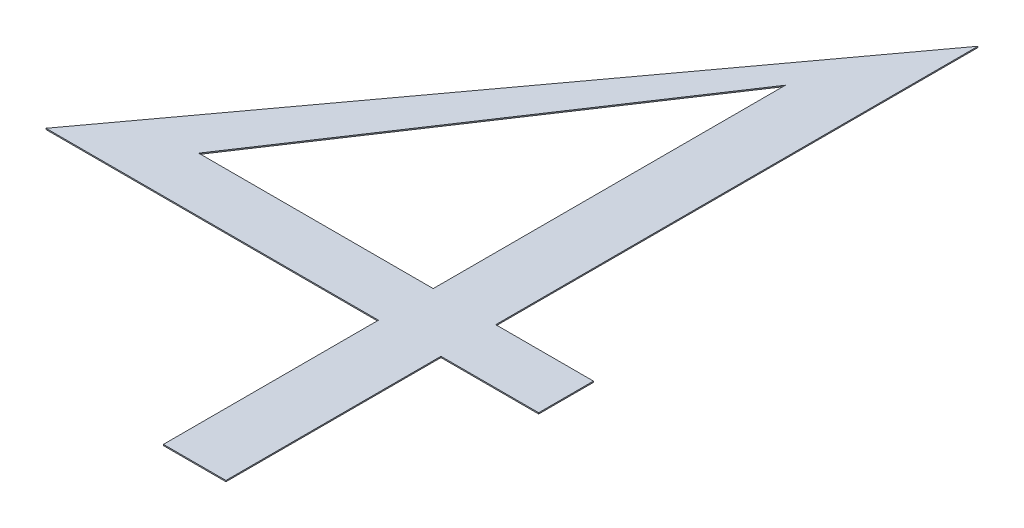
ISO-10303-21;
HEADER;
FILE_DESCRIPTION(('STEP AP214'),'2;1');
FILE_NAME('part.step','',(''),(''),'','','');
FILE_SCHEMA(('AUTOMOTIVE_DESIGN { 1 0 10303 214 1 1 1 1 }'));
ENDSEC;
DATA;
#1=APPLICATION_CONTEXT('core data for automotive mechanical design processes');
#2=APPLICATION_PROTOCOL_DEFINITION('international standard','automotive_design',2000,#1);
#3=PRODUCT_CONTEXT('',#1,'mechanical');
#4=PRODUCT('Part','Part','',(#3));
#5=PRODUCT_RELATED_PRODUCT_CATEGORY('part','',(#4));
#6=PRODUCT_DEFINITION_FORMATION('','',#4);
#7=PRODUCT_DEFINITION_CONTEXT('part definition',#1,'design');
#8=PRODUCT_DEFINITION('design','',#6,#7);
#9=PRODUCT_DEFINITION_SHAPE('','',#8);
#10=(LENGTH_UNIT() NAMED_UNIT(*) SI_UNIT(.MILLI.,.METRE.));
#11=(NAMED_UNIT(*) PLANE_ANGLE_UNIT() SI_UNIT($,.RADIAN.));
#12=(NAMED_UNIT(*) SI_UNIT($,.STERADIAN.) SOLID_ANGLE_UNIT());
#13=UNCERTAINTY_MEASURE_WITH_UNIT(LENGTH_MEASURE(1.E-05),#10,'distance_accuracy_value','');
#14=(GEOMETRIC_REPRESENTATION_CONTEXT(3) GLOBAL_UNCERTAINTY_ASSIGNED_CONTEXT((#13)) GLOBAL_UNIT_ASSIGNED_CONTEXT((#10,
#11,#12)) REPRESENTATION_CONTEXT('',''));
#15=CARTESIAN_POINT('',(0.,0.,0.));
#16=DIRECTION('',(0.,0.,1.));
#17=DIRECTION('',(1.,0.,0.));
#18=AXIS2_PLACEMENT_3D('',#15,#16,#17);
#19=CARTESIAN_POINT('',(0.,1.401,0.));
#20=DIRECTION('',(0.,-1.,0.));
#21=DIRECTION('',(0.,0.,-1.));
#22=AXIS2_PLACEMENT_3D('',#19,#20,#21);
#23=PLANE('',#22);
#24=DIRECTION('',(0.554239481862833,0.,-0.832357253073714));
#25=VECTOR('',#24,1.);
#26=CARTESIAN_POINT('',(4.96913967561164,1.401,-1.13796096168256));
#27=LINE('',#26,#25);
#28=CARTESIAN_POINT('',(4.96913967561164,1.401,-1.13796096168256));
#29=VERTEX_POINT('',#28);
#30=CARTESIAN_POINT('',(4.7663279732751,1.401,-0.833378201030688));
#31=VERTEX_POINT('',#30);
#32=EDGE_CURVE('E172',#29,#31,#27,.F.);
#33=ORIENTED_EDGE('',*,*,#32,.F.);
#34=DIRECTION('',(0.,0.,1.));
#35=VECTOR('',#34,1.);
#36=CARTESIAN_POINT('',(4.96913967561164,1.401,-0.833378201030688));
#37=LINE('',#36,#35);
#38=CARTESIAN_POINT('',(4.96913967561164,1.401,-0.833378201030688));
#39=VERTEX_POINT('',#38);
#40=EDGE_CURVE('E128',#39,#29,#37,.F.);
#41=ORIENTED_EDGE('',*,*,#40,.F.);
#42=DIRECTION('',(-1.,0.,0.));
#43=VECTOR('',#42,1.);
#44=CARTESIAN_POINT('',(4.7663279732751,1.401,-0.833378201030688));
#45=LINE('',#44,#43);
#46=EDGE_CURVE('E168',#31,#39,#45,.F.);
#47=ORIENTED_EDGE('',*,*,#46,.F.);
#48=EDGE_LOOP('',(#33,#41,#47));
#49=FACE_BOUND('',#48,.T.);
#50=DIRECTION('',(-1.,0.,0.));
#51=VECTOR('',#50,1.);
#52=CARTESIAN_POINT('',(5.0231903333772,1.401,-0.833378201030688));
#53=LINE('',#52,#51);
#54=CARTESIAN_POINT('',(5.0231903333772,1.401,-0.833378201030688));
#55=VERTEX_POINT('',#54);
#56=CARTESIAN_POINT('',(5.10767492006481,1.401,-0.833378201030688));
#57=VERTEX_POINT('',#56);
#58=EDGE_CURVE('E175',#55,#57,#53,.F.);
#59=ORIENTED_EDGE('',*,*,#58,.F.);
#60=DIRECTION('',(0.,0.,-1.));
#61=VECTOR('',#60,1.);
#62=CARTESIAN_POINT('',(5.0231903333772,1.401,-1.25032302726277));
#63=LINE('',#62,#61);
#64=CARTESIAN_POINT('',(5.0231903333772,1.401,-1.25032302726277));
#65=VERTEX_POINT('',#64);
#66=EDGE_CURVE('E133',#65,#55,#63,.F.);
#67=ORIENTED_EDGE('',*,*,#66,.F.);
#68=DIRECTION('',(-0.59247109285264,0.,0.805591710566834));
#69=VECTOR('',#68,1.);
#70=CARTESIAN_POINT('',(4.6817216508718,1.401,-0.786023007627978));
#71=LINE('',#70,#69);
#72=CARTESIAN_POINT('',(4.6817216508718,1.401,-0.786023007627978));
#73=VERTEX_POINT('',#72);
#74=EDGE_CURVE('E142',#73,#65,#71,.F.);
#75=ORIENTED_EDGE('',*,*,#74,.F.);
#76=DIRECTION('',(1.,0.,0.));
#77=VECTOR('',#76,1.);
#78=CARTESIAN_POINT('',(4.96913967561164,1.401,-0.786023007627978));
#79=LINE('',#78,#77);
#80=CARTESIAN_POINT('',(4.96913967561164,1.401,-0.786023007627978));
#81=VERTEX_POINT('',#80);
#82=EDGE_CURVE('E148',#81,#73,#79,.F.);
#83=ORIENTED_EDGE('',*,*,#82,.F.);
#84=DIRECTION('',(0.,0.,1.));
#85=VECTOR('',#84,1.);
#86=CARTESIAN_POINT('',(4.96913967561164,1.401,-0.600132569772098));
#87=LINE('',#86,#85);
#88=CARTESIAN_POINT('',(4.96913967561164,1.401,-0.600132569772098));
#89=VERTEX_POINT('',#88);
#90=EDGE_CURVE('E154',#89,#81,#87,.F.);
#91=ORIENTED_EDGE('',*,*,#90,.F.);
#92=DIRECTION('',(1.,0.,0.));
#93=VECTOR('',#92,1.);
#94=CARTESIAN_POINT('',(5.0231903333772,1.401,-0.600132569772098));
#95=LINE('',#94,#93);
#96=CARTESIAN_POINT('',(5.0231903333772,1.401,-0.600132569772098));
#97=VERTEX_POINT('',#96);
#98=EDGE_CURVE('E159',#97,#89,#95,.F.);
#99=ORIENTED_EDGE('',*,*,#98,.F.);
#100=DIRECTION('',(0.,0.,-1.));
#101=VECTOR('',#100,1.);
#102=CARTESIAN_POINT('',(5.0231903333772,1.401,-0.786023007627978));
#103=LINE('',#102,#101);
#104=CARTESIAN_POINT('',(5.0231903333772,1.401,-0.786023007627978));
#105=VERTEX_POINT('',#104);
#106=EDGE_CURVE('E163',#105,#97,#103,.F.);
#107=ORIENTED_EDGE('',*,*,#106,.F.);
#108=DIRECTION('',(1.,0.,0.));
#109=VECTOR('',#108,1.);
#110=CARTESIAN_POINT('',(5.10767492006481,1.401,-0.786023007627978));
#111=LINE('',#110,#109);
#112=CARTESIAN_POINT('',(5.10767492006481,1.401,-0.786023007627978));
#113=VERTEX_POINT('',#112);
#114=EDGE_CURVE('E109',#113,#105,#111,.F.);
#115=ORIENTED_EDGE('',*,*,#114,.F.);
#116=DIRECTION('',(0.,0.,-1.));
#117=VECTOR('',#116,1.);
#118=CARTESIAN_POINT('',(5.10767492006481,1.401,-0.833378201030688));
#119=LINE('',#118,#117);
#120=EDGE_CURVE('E106',#57,#113,#119,.F.);
#121=ORIENTED_EDGE('',*,*,#120,.F.);
#122=EDGE_LOOP('',(#59,#67,#75,#83,#91,#99,#107,#115,#121));
#123=FACE_BOUND('',#122,.T.);
#124=ADVANCED_FACE('F16',(#49,#123),#23,.F.);
#125=CARTESIAN_POINT('',(5.10767492006481,1.401,-0.833378201030688));
#126=DIRECTION('',(1.,0.,0.));
#127=DIRECTION('',(0.,0.,-1.));
#128=AXIS2_PLACEMENT_3D('',#125,#126,#127);
#129=PLANE('',#128);
#130=ORIENTED_EDGE('',*,*,#120,.T.);
#131=DIRECTION('',(0.,1.,0.));
#132=VECTOR('',#131,1.);
#133=CARTESIAN_POINT('',(5.10767492006481,1.401,-0.786023007627978));
#134=LINE('',#133,#132);
#135=CARTESIAN_POINT('',(5.10767492006481,1.4,-0.786023007627978));
#136=VERTEX_POINT('',#135);
#137=EDGE_CURVE('E19',#136,#113,#134,.T.);
#138=ORIENTED_EDGE('',*,*,#137,.F.);
#139=DIRECTION('',(0.,0.,-1.));
#140=VECTOR('',#139,1.);
#141=CARTESIAN_POINT('',(5.10767492006481,1.4,0.));
#142=LINE('',#141,#140);
#143=CARTESIAN_POINT('',(5.10767492006481,1.4,-0.833378201030688));
#144=VERTEX_POINT('',#143);
#145=EDGE_CURVE('E104',#144,#136,#142,.F.);
#146=ORIENTED_EDGE('',*,*,#145,.F.);
#147=DIRECTION('',(0.,1.,0.));
#148=VECTOR('',#147,1.);
#149=CARTESIAN_POINT('',(5.10767492006481,1.401,-0.833378201030688));
#150=LINE('',#149,#148);
#151=EDGE_CURVE('E173',#57,#144,#150,.F.);
#152=ORIENTED_EDGE('',*,*,#151,.F.);
#153=EDGE_LOOP('',(#130,#138,#146,#152));
#154=FACE_BOUND('',#153,.T.);
#155=ADVANCED_FACE('F101',(#154),#129,.T.);
#156=CARTESIAN_POINT('',(5.10767492006481,1.401,-0.786023007627978));
#157=DIRECTION('',(0.,0.,1.));
#158=DIRECTION('',(1.,0.,0.));
#159=AXIS2_PLACEMENT_3D('',#156,#157,#158);
#160=PLANE('',#159);
#161=ORIENTED_EDGE('',*,*,#114,.T.);
#162=DIRECTION('',(0.,1.,0.));
#163=VECTOR('',#162,1.);
#164=CARTESIAN_POINT('',(5.0231903333772,1.401,-0.786023007627978));
#165=LINE('',#164,#163);
#166=CARTESIAN_POINT('',(5.0231903333772,1.4,-0.786023007627978));
#167=VERTEX_POINT('',#166);
#168=EDGE_CURVE('E114',#167,#105,#165,.T.);
#169=ORIENTED_EDGE('',*,*,#168,.F.);
#170=DIRECTION('',(1.,0.,0.));
#171=VECTOR('',#170,1.);
#172=CARTESIAN_POINT('',(0.,1.4,-0.786023007627978));
#173=LINE('',#172,#171);
#174=EDGE_CURVE('E111',#136,#167,#173,.F.);
#175=ORIENTED_EDGE('',*,*,#174,.F.);
#176=ORIENTED_EDGE('',*,*,#137,.T.);
#177=EDGE_LOOP('',(#161,#169,#175,#176));
#178=FACE_BOUND('',#177,.T.);
#179=ADVANCED_FACE('F112',(#178),#160,.T.);
#180=CARTESIAN_POINT('',(5.0231903333772,1.401,-0.786023007627978));
#181=DIRECTION('',(1.,0.,0.));
#182=DIRECTION('',(0.,0.,-1.));
#183=AXIS2_PLACEMENT_3D('',#180,#181,#182);
#184=PLANE('',#183);
#185=ORIENTED_EDGE('',*,*,#106,.T.);
#186=DIRECTION('',(0.,1.,0.));
#187=VECTOR('',#186,1.);
#188=CARTESIAN_POINT('',(5.0231903333772,1.401,-0.600132569772098));
#189=LINE('',#188,#187);
#190=CARTESIAN_POINT('',(5.0231903333772,1.4,-0.600132569772098));
#191=VERTEX_POINT('',#190);
#192=EDGE_CURVE('E161',#191,#97,#189,.T.);
#193=ORIENTED_EDGE('',*,*,#192,.F.);
#194=DIRECTION('',(0.,0.,-1.));
#195=VECTOR('',#194,1.);
#196=CARTESIAN_POINT('',(5.0231903333772,1.4,0.));
#197=LINE('',#196,#195);
#198=EDGE_CURVE('E118',#167,#191,#197,.F.);
#199=ORIENTED_EDGE('',*,*,#198,.F.);
#200=ORIENTED_EDGE('',*,*,#168,.T.);
#201=EDGE_LOOP('',(#185,#193,#199,#200));
#202=FACE_BOUND('',#201,.T.);
#203=ADVANCED_FACE('F188',(#202),#184,.T.);
#204=CARTESIAN_POINT('',(5.0231903333772,1.401,-0.600132569772098));
#205=DIRECTION('',(0.,0.,1.));
#206=DIRECTION('',(1.,0.,0.));
#207=AXIS2_PLACEMENT_3D('',#204,#205,#206);
#208=PLANE('',#207);
#209=ORIENTED_EDGE('',*,*,#98,.T.);
#210=DIRECTION('',(0.,1.,0.));
#211=VECTOR('',#210,1.);
#212=CARTESIAN_POINT('',(4.96913967561164,1.401,-0.600132569772098));
#213=LINE('',#212,#211);
#214=CARTESIAN_POINT('',(4.96913967561164,1.4,-0.600132569772098));
#215=VERTEX_POINT('',#214);
#216=EDGE_CURVE('E156',#215,#89,#213,.T.);
#217=ORIENTED_EDGE('',*,*,#216,.F.);
#218=DIRECTION('',(1.,0.,0.));
#219=VECTOR('',#218,1.);
#220=CARTESIAN_POINT('',(0.,1.4,-0.600132569772098));
#221=LINE('',#220,#219);
#222=EDGE_CURVE('E153',#191,#215,#221,.F.);
#223=ORIENTED_EDGE('',*,*,#222,.F.);
#224=ORIENTED_EDGE('',*,*,#192,.T.);
#225=EDGE_LOOP('',(#209,#217,#223,#224));
#226=FACE_BOUND('',#225,.T.);
#227=ADVANCED_FACE('F194',(#226),#208,.T.);
#228=CARTESIAN_POINT('',(4.96913967561164,1.401,-0.600132569772098));
#229=DIRECTION('',(-1.,0.,0.));
#230=DIRECTION('',(0.,0.,1.));
#231=AXIS2_PLACEMENT_3D('',#228,#229,#230);
#232=PLANE('',#231);
#233=ORIENTED_EDGE('',*,*,#90,.T.);
#234=DIRECTION('',(0.,1.,0.));
#235=VECTOR('',#234,1.);
#236=CARTESIAN_POINT('',(4.96913967561164,1.401,-0.786023007627978));
#237=LINE('',#236,#235);
#238=CARTESIAN_POINT('',(4.96913967561164,1.4,-0.786023007627978));
#239=VERTEX_POINT('',#238);
#240=EDGE_CURVE('E150',#239,#81,#237,.T.);
#241=ORIENTED_EDGE('',*,*,#240,.F.);
#242=DIRECTION('',(0.,0.,-1.));
#243=VECTOR('',#242,1.);
#244=CARTESIAN_POINT('',(4.96913967561164,1.4,0.));
#245=LINE('',#244,#243);
#246=EDGE_CURVE('E147',#215,#239,#245,.T.);
#247=ORIENTED_EDGE('',*,*,#246,.F.);
#248=ORIENTED_EDGE('',*,*,#216,.T.);
#249=EDGE_LOOP('',(#233,#241,#247,#248));
#250=FACE_BOUND('',#249,.T.);
#251=ADVANCED_FACE('F197',(#250),#232,.T.);
#252=CARTESIAN_POINT('',(4.96913967561164,1.401,-0.786023007627978));
#253=DIRECTION('',(0.,0.,1.));
#254=DIRECTION('',(1.,0.,0.));
#255=AXIS2_PLACEMENT_3D('',#252,#253,#254);
#256=PLANE('',#255);
#257=ORIENTED_EDGE('',*,*,#82,.T.);
#258=DIRECTION('',(0.,1.,0.));
#259=VECTOR('',#258,1.);
#260=CARTESIAN_POINT('',(4.6817216508718,1.401,-0.786023007627978));
#261=LINE('',#260,#259);
#262=CARTESIAN_POINT('',(4.6817216508718,1.4,-0.786023007627978));
#263=VERTEX_POINT('',#262);
#264=EDGE_CURVE('E144',#263,#73,#261,.T.);
#265=ORIENTED_EDGE('',*,*,#264,.F.);
#266=DIRECTION('',(1.,0.,0.));
#267=VECTOR('',#266,1.);
#268=CARTESIAN_POINT('',(0.,1.4,-0.786023007627978));
#269=LINE('',#268,#267);
#270=EDGE_CURVE('E141',#239,#263,#269,.F.);
#271=ORIENTED_EDGE('',*,*,#270,.F.);
#272=ORIENTED_EDGE('',*,*,#240,.T.);
#273=EDGE_LOOP('',(#257,#265,#271,#272));
#274=FACE_BOUND('',#273,.T.);
#275=ADVANCED_FACE('F201',(#274),#256,.T.);
#276=CARTESIAN_POINT('',(4.6817216508718,1.401,-0.786023007627978));
#277=DIRECTION('',(-0.805591710566834,0.,-0.59247109285264));
#278=DIRECTION('',(-0.59247109285264,0.,0.805591710566834));
#279=AXIS2_PLACEMENT_3D('',#276,#277,#278);
#280=PLANE('',#279);
#281=ORIENTED_EDGE('',*,*,#74,.T.);
#282=DIRECTION('',(0.,1.,0.));
#283=VECTOR('',#282,1.);
#284=CARTESIAN_POINT('',(5.0231903333772,1.401,-1.25032302726277));
#285=LINE('',#284,#283);
#286=CARTESIAN_POINT('',(5.0231903333772,1.4,-1.25032302726277));
#287=VERTEX_POINT('',#286);
#288=EDGE_CURVE('E136',#287,#65,#285,.T.);
#289=ORIENTED_EDGE('',*,*,#288,.F.);
#290=DIRECTION('',(0.592471092852642,0.,-0.805591710566833));
#291=VECTOR('',#290,1.);
#292=CARTESIAN_POINT('',(4.6817216508718,1.4,-0.786023007627978));
#293=LINE('',#292,#291);
#294=EDGE_CURVE('E137',#263,#287,#293,.T.);
#295=ORIENTED_EDGE('',*,*,#294,.F.);
#296=ORIENTED_EDGE('',*,*,#264,.T.);
#297=EDGE_LOOP('',(#281,#289,#295,#296));
#298=FACE_BOUND('',#297,.T.);
#299=ADVANCED_FACE('F205',(#298),#280,.T.);
#300=CARTESIAN_POINT('',(5.0231903333772,1.401,-1.25032302726277));
#301=DIRECTION('',(1.,0.,0.));
#302=DIRECTION('',(0.,0.,-1.));
#303=AXIS2_PLACEMENT_3D('',#300,#301,#302);
#304=PLANE('',#303);
#305=ORIENTED_EDGE('',*,*,#66,.T.);
#306=DIRECTION('',(0.,1.,0.));
#307=VECTOR('',#306,1.);
#308=CARTESIAN_POINT('',(5.0231903333772,1.401,-0.833378201030688));
#309=LINE('',#308,#307);
#310=CARTESIAN_POINT('',(5.0231903333772,1.4,-0.833378201030688));
#311=VERTEX_POINT('',#310);
#312=EDGE_CURVE('E135',#311,#55,#309,.T.);
#313=ORIENTED_EDGE('',*,*,#312,.F.);
#314=DIRECTION('',(0.,0.,-1.));
#315=VECTOR('',#314,1.);
#316=CARTESIAN_POINT('',(5.0231903333772,1.4,0.));
#317=LINE('',#316,#315);
#318=EDGE_CURVE('E140',#287,#311,#317,.F.);
#319=ORIENTED_EDGE('',*,*,#318,.F.);
#320=ORIENTED_EDGE('',*,*,#288,.T.);
#321=EDGE_LOOP('',(#305,#313,#319,#320));
#322=FACE_BOUND('',#321,.T.);
#323=ADVANCED_FACE('F209',(#322),#304,.T.);
#324=CARTESIAN_POINT('',(5.0231903333772,1.401,-0.833378201030688));
#325=DIRECTION('',(0.,0.,-1.));
#326=DIRECTION('',(-1.,0.,0.));
#327=AXIS2_PLACEMENT_3D('',#324,#325,#326);
#328=PLANE('',#327);
#329=ORIENTED_EDGE('',*,*,#58,.T.);
#330=ORIENTED_EDGE('',*,*,#151,.T.);
#331=DIRECTION('',(1.,0.,0.));
#332=VECTOR('',#331,1.);
#333=CARTESIAN_POINT('',(0.,1.4,-0.833378201030688));
#334=LINE('',#333,#332);
#335=EDGE_CURVE('E124',#311,#144,#334,.T.);
#336=ORIENTED_EDGE('',*,*,#335,.F.);
#337=ORIENTED_EDGE('',*,*,#312,.T.);
#338=EDGE_LOOP('',(#329,#330,#336,#337));
#339=FACE_BOUND('',#338,.T.);
#340=ADVANCED_FACE('F242',(#339),#328,.T.);
#341=CARTESIAN_POINT('',(4.96913967561164,1.401,-1.13796096168256));
#342=DIRECTION('',(0.832357253073714,0.,0.554239481862833));
#343=DIRECTION('',(0.554239481862833,0.,-0.832357253073714));
#344=AXIS2_PLACEMENT_3D('',#341,#342,#343);
#345=PLANE('',#344);
#346=ORIENTED_EDGE('',*,*,#32,.T.);
#347=DIRECTION('',(0.,1.,0.));
#348=VECTOR('',#347,1.);
#349=CARTESIAN_POINT('',(4.7663279732751,1.401,-0.833378201030688));
#350=LINE('',#349,#348);
#351=CARTESIAN_POINT('',(4.7663279732751,1.4,-0.833378201030688));
#352=VERTEX_POINT('',#351);
#353=EDGE_CURVE('E169',#352,#31,#350,.T.);
#354=ORIENTED_EDGE('',*,*,#353,.F.);
#355=DIRECTION('',(-0.554239481862835,0.,0.832357253073712));
#356=VECTOR('',#355,1.);
#357=CARTESIAN_POINT('',(4.96913967561164,1.4,-1.13796096168256));
#358=LINE('',#357,#356);
#359=CARTESIAN_POINT('',(4.96913967561164,1.4,-1.13796096168256));
#360=VERTEX_POINT('',#359);
#361=EDGE_CURVE('E210',#360,#352,#358,.T.);
#362=ORIENTED_EDGE('',*,*,#361,.F.);
#363=DIRECTION('',(0.,1.,0.));
#364=VECTOR('',#363,1.);
#365=CARTESIAN_POINT('',(4.96913967561164,1.401,-1.13796096168256));
#366=LINE('',#365,#364);
#367=EDGE_CURVE('E125',#29,#360,#366,.F.);
#368=ORIENTED_EDGE('',*,*,#367,.F.);
#369=EDGE_LOOP('',(#346,#354,#362,#368));
#370=FACE_BOUND('',#369,.T.);
#371=ADVANCED_FACE('F231',(#370),#345,.T.);
#372=CARTESIAN_POINT('',(4.7663279732751,1.401,-0.833378201030688));
#373=DIRECTION('',(0.,0.,-1.));
#374=DIRECTION('',(-1.,0.,0.));
#375=AXIS2_PLACEMENT_3D('',#372,#373,#374);
#376=PLANE('',#375);
#377=ORIENTED_EDGE('',*,*,#46,.T.);
#378=DIRECTION('',(0.,1.,0.));
#379=VECTOR('',#378,1.);
#380=CARTESIAN_POINT('',(4.96913967561164,1.401,-0.833378201030688));
#381=LINE('',#380,#379);
#382=CARTESIAN_POINT('',(4.96913967561164,1.4,-0.833378201030688));
#383=VERTEX_POINT('',#382);
#384=EDGE_CURVE('E34',#383,#39,#381,.T.);
#385=ORIENTED_EDGE('',*,*,#384,.F.);
#386=DIRECTION('',(1.,0.,0.));
#387=VECTOR('',#386,1.);
#388=CARTESIAN_POINT('',(0.,1.4,-0.833378201030688));
#389=LINE('',#388,#387);
#390=EDGE_CURVE('E25',#352,#383,#389,.T.);
#391=ORIENTED_EDGE('',*,*,#390,.F.);
#392=ORIENTED_EDGE('',*,*,#353,.T.);
#393=EDGE_LOOP('',(#377,#385,#391,#392));
#394=FACE_BOUND('',#393,.T.);
#395=ADVANCED_FACE('F233',(#394),#376,.T.);
#396=CARTESIAN_POINT('',(4.96913967561164,1.401,-0.833378201030688));
#397=DIRECTION('',(-1.,0.,0.));
#398=DIRECTION('',(0.,0.,1.));
#399=AXIS2_PLACEMENT_3D('',#396,#397,#398);
#400=PLANE('',#399);
#401=ORIENTED_EDGE('',*,*,#40,.T.);
#402=ORIENTED_EDGE('',*,*,#367,.T.);
#403=DIRECTION('',(0.,0.,-1.));
#404=VECTOR('',#403,1.);
#405=CARTESIAN_POINT('',(4.96913967561164,1.4,0.));
#406=LINE('',#405,#404);
#407=EDGE_CURVE('E11',#383,#360,#406,.T.);
#408=ORIENTED_EDGE('',*,*,#407,.F.);
#409=ORIENTED_EDGE('',*,*,#384,.T.);
#410=EDGE_LOOP('',(#401,#402,#408,#409));
#411=FACE_BOUND('',#410,.T.);
#412=ADVANCED_FACE('F223',(#411),#400,.T.);
#413=CARTESIAN_POINT('',(0.,1.4,0.));
#414=DIRECTION('',(0.,-1.,0.));
#415=DIRECTION('',(0.,0.,-1.));
#416=AXIS2_PLACEMENT_3D('',#413,#414,#415);
#417=PLANE('',#416);
#418=ORIENTED_EDGE('',*,*,#390,.T.);
#419=ORIENTED_EDGE('',*,*,#407,.T.);
#420=ORIENTED_EDGE('',*,*,#361,.T.);
#421=EDGE_LOOP('',(#418,#419,#420));
#422=FACE_BOUND('',#421,.T.);
#423=ORIENTED_EDGE('',*,*,#318,.T.);
#424=ORIENTED_EDGE('',*,*,#335,.T.);
#425=ORIENTED_EDGE('',*,*,#145,.T.);
#426=ORIENTED_EDGE('',*,*,#174,.T.);
#427=ORIENTED_EDGE('',*,*,#198,.T.);
#428=ORIENTED_EDGE('',*,*,#222,.T.);
#429=ORIENTED_EDGE('',*,*,#246,.T.);
#430=ORIENTED_EDGE('',*,*,#270,.T.);
#431=ORIENTED_EDGE('',*,*,#294,.T.);
#432=EDGE_LOOP('',(#423,#424,#425,#426,#427,#428,#429,#430,#431));
#433=FACE_BOUND('',#432,.T.);
#434=ADVANCED_FACE('F122',(#422,#433),#417,.T.);
#435=CLOSED_SHELL('',(#124,#155,#179,#203,#227,#251,#275,#299,#323,#340,#371,#395,#412,#434));
#436=MANIFOLD_SOLID_BREP('B1',#435);
#437=ADVANCED_BREP_SHAPE_REPRESENTATION('',(#18,#436),#14);
#438=SHAPE_DEFINITION_REPRESENTATION(#9,#437);
ENDSEC;
END-ISO-10303-21;
